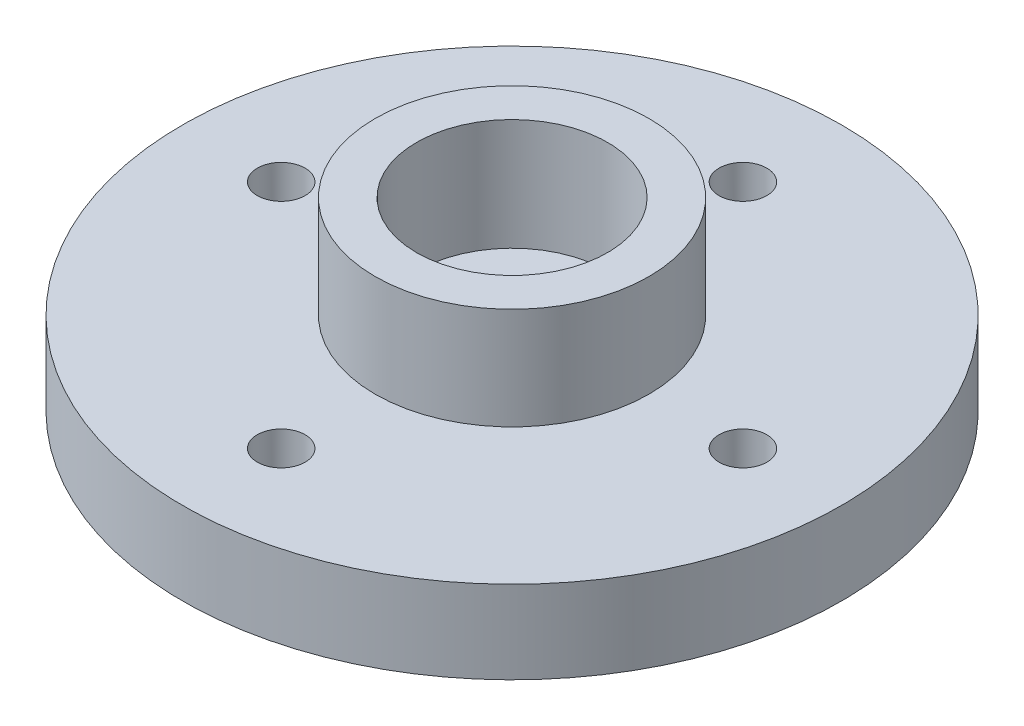
ISO-10303-21;
HEADER;
FILE_DESCRIPTION(('STEP AP214'),'2;1');
FILE_NAME('part.step','',(''),(''),'','','');
FILE_SCHEMA(('AUTOMOTIVE_DESIGN { 1 0 10303 214 1 1 1 1 }'));
ENDSEC;
DATA;
#1=APPLICATION_CONTEXT('core data for automotive mechanical design processes');
#2=APPLICATION_PROTOCOL_DEFINITION('international standard','automotive_design',2000,#1);
#3=PRODUCT_CONTEXT('',#1,'mechanical');
#4=PRODUCT('Part','Part','',(#3));
#5=PRODUCT_RELATED_PRODUCT_CATEGORY('part','',(#4));
#6=PRODUCT_DEFINITION_FORMATION('','',#4);
#7=PRODUCT_DEFINITION_CONTEXT('part definition',#1,'design');
#8=PRODUCT_DEFINITION('design','',#6,#7);
#9=PRODUCT_DEFINITION_SHAPE('','',#8);
#10=(LENGTH_UNIT() NAMED_UNIT(*) SI_UNIT(.MILLI.,.METRE.));
#11=(NAMED_UNIT(*) PLANE_ANGLE_UNIT() SI_UNIT($,.RADIAN.));
#12=(NAMED_UNIT(*) SI_UNIT($,.STERADIAN.) SOLID_ANGLE_UNIT());
#13=UNCERTAINTY_MEASURE_WITH_UNIT(LENGTH_MEASURE(1.E-05),#10,'distance_accuracy_value','');
#14=(GEOMETRIC_REPRESENTATION_CONTEXT(3) GLOBAL_UNCERTAINTY_ASSIGNED_CONTEXT((#13)) GLOBAL_UNIT_ASSIGNED_CONTEXT((#10,
#11,#12)) REPRESENTATION_CONTEXT('',''));
#15=CARTESIAN_POINT('',(0.,0.,0.));
#16=DIRECTION('',(0.,0.,1.));
#17=DIRECTION('',(1.,0.,0.));
#18=AXIS2_PLACEMENT_3D('',#15,#16,#17);
#19=CARTESIAN_POINT('',(0.,-0.6,0.));
#20=DIRECTION('',(0.,1.,0.));
#21=DIRECTION('',(0.,0.,1.));
#22=AXIS2_PLACEMENT_3D('',#19,#20,#21);
#23=PLANE('',#22);
#24=CARTESIAN_POINT('',(0.,-0.6,0.));
#25=DIRECTION('',(0.,-1.,0.));
#26=DIRECTION('',(0.,0.,-1.));
#27=AXIS2_PLACEMENT_3D('',#24,#25,#26);
#28=CIRCLE('',#27,3.55);
#29=CARTESIAN_POINT('',(0.,-0.6,-3.55));
#30=VERTEX_POINT('',#29);
#31=EDGE_CURVE('E10',#30,#30,#28,.T.);
#32=ORIENTED_EDGE('',*,*,#31,.T.);
#33=EDGE_LOOP('',(#32));
#34=FACE_BOUND('',#33,.T.);
#35=CARTESIAN_POINT('',(0.,-0.6,0.));
#36=DIRECTION('',(0.,1.,0.));
#37=DIRECTION('',(0.,0.,1.));
#38=AXIS2_PLACEMENT_3D('',#35,#36,#37);
#39=CIRCLE('',#38,1.5);
#40=CARTESIAN_POINT('',(0.,-0.600000000000002,1.5));
#41=VERTEX_POINT('',#40);
#42=EDGE_CURVE('E133',#41,#41,#39,.F.);
#43=ORIENTED_EDGE('',*,*,#42,.F.);
#44=EDGE_LOOP('',(#43));
#45=FACE_BOUND('',#44,.T.);
#46=ADVANCED_FACE('F39',(#34,#45),#23,.F.);
#47=CARTESIAN_POINT('',(0.,0.,0.));
#48=DIRECTION('',(0.,1.,0.));
#49=DIRECTION('',(0.,0.,1.));
#50=AXIS2_PLACEMENT_3D('',#47,#48,#49);
#51=CONICAL_SURFACE('',#50,4.83670415230573,1.13446401379631);
#52=ORIENTED_EDGE('',*,*,#31,.F.);
#53=EDGE_LOOP('',(#52));
#54=FACE_BOUND('',#53,.T.);
#55=CARTESIAN_POINT('',(0.,0.,0.));
#56=DIRECTION('',(0.,-1.,0.));
#57=DIRECTION('',(0.,0.,-1.));
#58=AXIS2_PLACEMENT_3D('',#55,#56,#57);
#59=CIRCLE('',#58,4.83670415230573);
#60=CARTESIAN_POINT('',(0.,0.,-4.83670415230573));
#61=VERTEX_POINT('',#60);
#62=EDGE_CURVE('E46',#61,#61,#59,.T.);
#63=ORIENTED_EDGE('',*,*,#62,.T.);
#64=EDGE_LOOP('',(#63));
#65=FACE_BOUND('',#64,.T.);
#66=ADVANCED_FACE('F127',(#54,#65),#51,.T.);
#67=CARTESIAN_POINT('',(-4.83670415230573,0.,0.));
#68=DIRECTION('',(0.,1.,0.));
#69=DIRECTION('',(0.,0.,1.));
#70=AXIS2_PLACEMENT_3D('',#67,#68,#69);
#71=PLANE('',#70);
#72=CARTESIAN_POINT('',(0.,0.,-7.25));
#73=DIRECTION('',(0.,1.,0.));
#74=DIRECTION('',(0.,0.,1.));
#75=AXIS2_PLACEMENT_3D('',#72,#73,#74);
#76=CIRCLE('',#75,0.75);
#77=CARTESIAN_POINT('',(0.,0.,-6.5));
#78=VERTEX_POINT('',#77);
#79=EDGE_CURVE('E80',#78,#78,#76,.T.);
#80=ORIENTED_EDGE('',*,*,#79,.T.);
#81=EDGE_LOOP('',(#80));
#82=FACE_BOUND('',#81,.T.);
#83=CARTESIAN_POINT('',(7.25,0.,0.));
#84=DIRECTION('',(0.,1.,0.));
#85=DIRECTION('',(0.,0.,1.));
#86=AXIS2_PLACEMENT_3D('',#83,#84,#85);
#87=CIRCLE('',#86,0.75);
#88=CARTESIAN_POINT('',(7.25,0.,0.750000000000025));
#89=VERTEX_POINT('',#88);
#90=EDGE_CURVE('E63',#89,#89,#87,.T.);
#91=ORIENTED_EDGE('',*,*,#90,.T.);
#92=EDGE_LOOP('',(#91));
#93=FACE_BOUND('',#92,.T.);
#94=CARTESIAN_POINT('',(0.,0.,7.25));
#95=DIRECTION('',(0.,1.,0.));
#96=DIRECTION('',(0.,0.,1.));
#97=AXIS2_PLACEMENT_3D('',#94,#95,#96);
#98=CIRCLE('',#97,0.75);
#99=CARTESIAN_POINT('',(0.,0.,8.));
#100=VERTEX_POINT('',#99);
#101=EDGE_CURVE('E65',#100,#100,#98,.T.);
#102=ORIENTED_EDGE('',*,*,#101,.T.);
#103=EDGE_LOOP('',(#102));
#104=FACE_BOUND('',#103,.T.);
#105=CARTESIAN_POINT('',(-7.25,0.,0.));
#106=DIRECTION('',(0.,1.,0.));
#107=DIRECTION('',(0.,0.,1.));
#108=AXIS2_PLACEMENT_3D('',#105,#106,#107);
#109=CIRCLE('',#108,0.75);
#110=CARTESIAN_POINT('',(-7.25,0.,0.749999999999924));
#111=VERTEX_POINT('',#110);
#112=EDGE_CURVE('E59',#111,#111,#109,.T.);
#113=ORIENTED_EDGE('',*,*,#112,.T.);
#114=EDGE_LOOP('',(#113));
#115=FACE_BOUND('',#114,.T.);
#116=ORIENTED_EDGE('',*,*,#62,.F.);
#117=EDGE_LOOP('',(#116));
#118=FACE_BOUND('',#117,.T.);
#119=CARTESIAN_POINT('',(0.,0.,0.));
#120=DIRECTION('',(0.,-1.,0.));
#121=DIRECTION('',(0.,0.,-1.));
#122=AXIS2_PLACEMENT_3D('',#119,#120,#121);
#123=CIRCLE('',#122,10.35);
#124=CARTESIAN_POINT('',(0.,0.,-10.35));
#125=VERTEX_POINT('',#124);
#126=EDGE_CURVE('E51',#125,#125,#123,.T.);
#127=ORIENTED_EDGE('',*,*,#126,.T.);
#128=EDGE_LOOP('',(#127));
#129=FACE_BOUND('',#128,.T.);
#130=ADVANCED_FACE('F93',(#82,#93,#104,#115,#118,#129),#71,.F.);
#131=CARTESIAN_POINT('',(0.,0.,0.));
#132=DIRECTION('',(0.,-1.,0.));
#133=DIRECTION('',(0.,0.,-1.));
#134=AXIS2_PLACEMENT_3D('',#131,#132,#133);
#135=CYLINDRICAL_SURFACE('',#134,10.35);
#136=ORIENTED_EDGE('',*,*,#126,.F.);
#137=EDGE_LOOP('',(#136));
#138=FACE_BOUND('',#137,.T.);
#139=CARTESIAN_POINT('',(0.,2.6,0.));
#140=DIRECTION('',(0.,-1.,0.));
#141=DIRECTION('',(0.,0.,-1.));
#142=AXIS2_PLACEMENT_3D('',#139,#140,#141);
#143=CIRCLE('',#142,10.35);
#144=CARTESIAN_POINT('',(0.,2.6,-10.35));
#145=VERTEX_POINT('',#144);
#146=EDGE_CURVE('E87',#145,#145,#143,.T.);
#147=ORIENTED_EDGE('',*,*,#146,.T.);
#148=EDGE_LOOP('',(#147));
#149=FACE_BOUND('',#148,.T.);
#150=ADVANCED_FACE('F91',(#138,#149),#135,.T.);
#151=CARTESIAN_POINT('',(-10.35,2.6,0.));
#152=DIRECTION('',(0.,-1.,0.));
#153=DIRECTION('',(0.,0.,-1.));
#154=AXIS2_PLACEMENT_3D('',#151,#152,#153);
#155=PLANE('',#154);
#156=CARTESIAN_POINT('',(0.,2.6,-7.25));
#157=DIRECTION('',(0.,-1.,0.));
#158=DIRECTION('',(0.,0.,-1.));
#159=AXIS2_PLACEMENT_3D('',#156,#157,#158);
#160=CIRCLE('',#159,0.75);
#161=CARTESIAN_POINT('',(0.,2.6,-8.));
#162=VERTEX_POINT('',#161);
#163=EDGE_CURVE('E45',#162,#162,#160,.T.);
#164=ORIENTED_EDGE('',*,*,#163,.T.);
#165=EDGE_LOOP('',(#164));
#166=FACE_BOUND('',#165,.T.);
#167=CARTESIAN_POINT('',(7.25,2.6,0.));
#168=DIRECTION('',(0.,-1.,0.));
#169=DIRECTION('',(0.,0.,-1.));
#170=AXIS2_PLACEMENT_3D('',#167,#168,#169);
#171=CIRCLE('',#170,0.75);
#172=CARTESIAN_POINT('',(7.25,2.6,-0.749999999999975));
#173=VERTEX_POINT('',#172);
#174=EDGE_CURVE('E64',#173,#173,#171,.T.);
#175=ORIENTED_EDGE('',*,*,#174,.T.);
#176=EDGE_LOOP('',(#175));
#177=FACE_BOUND('',#176,.T.);
#178=CARTESIAN_POINT('',(0.,2.6,7.25));
#179=DIRECTION('',(0.,-1.,0.));
#180=DIRECTION('',(0.,0.,-1.));
#181=AXIS2_PLACEMENT_3D('',#178,#179,#180);
#182=CIRCLE('',#181,0.75);
#183=CARTESIAN_POINT('',(0.,2.6,6.5));
#184=VERTEX_POINT('',#183);
#185=EDGE_CURVE('E58',#184,#184,#182,.T.);
#186=ORIENTED_EDGE('',*,*,#185,.T.);
#187=EDGE_LOOP('',(#186));
#188=FACE_BOUND('',#187,.T.);
#189=CARTESIAN_POINT('',(-7.25,2.6,0.));
#190=DIRECTION('',(0.,-1.,0.));
#191=DIRECTION('',(0.,0.,-1.));
#192=AXIS2_PLACEMENT_3D('',#189,#190,#191);
#193=CIRCLE('',#192,0.75);
#194=CARTESIAN_POINT('',(-7.25,2.6,-0.750000000000076));
#195=VERTEX_POINT('',#194);
#196=EDGE_CURVE('E54',#195,#195,#193,.T.);
#197=ORIENTED_EDGE('',*,*,#196,.T.);
#198=EDGE_LOOP('',(#197));
#199=FACE_BOUND('',#198,.T.);
#200=ORIENTED_EDGE('',*,*,#146,.F.);
#201=EDGE_LOOP('',(#200));
#202=FACE_BOUND('',#201,.T.);
#203=CARTESIAN_POINT('',(0.,2.6,0.));
#204=DIRECTION('',(0.,-1.,0.));
#205=DIRECTION('',(0.,0.,-1.));
#206=AXIS2_PLACEMENT_3D('',#203,#204,#205);
#207=CIRCLE('',#206,4.3);
#208=CARTESIAN_POINT('',(0.,2.6,-4.3));
#209=VERTEX_POINT('',#208);
#210=EDGE_CURVE('E84',#209,#209,#207,.T.);
#211=ORIENTED_EDGE('',*,*,#210,.T.);
#212=EDGE_LOOP('',(#211));
#213=FACE_BOUND('',#212,.T.);
#214=ADVANCED_FACE('F98',(#166,#177,#188,#199,#202,#213),#155,.F.);
#215=CARTESIAN_POINT('',(0.,0.,0.));
#216=DIRECTION('',(0.,-1.,0.));
#217=DIRECTION('',(0.,0.,-1.));
#218=AXIS2_PLACEMENT_3D('',#215,#216,#217);
#219=CYLINDRICAL_SURFACE('',#218,4.3);
#220=ORIENTED_EDGE('',*,*,#210,.F.);
#221=EDGE_LOOP('',(#220));
#222=FACE_BOUND('',#221,.T.);
#223=CARTESIAN_POINT('',(0.,5.8,0.));
#224=DIRECTION('',(0.,-1.,0.));
#225=DIRECTION('',(0.,0.,-1.));
#226=AXIS2_PLACEMENT_3D('',#223,#224,#225);
#227=CIRCLE('',#226,4.3);
#228=CARTESIAN_POINT('',(0.,5.8,-4.3));
#229=VERTEX_POINT('',#228);
#230=EDGE_CURVE('E78',#229,#229,#227,.T.);
#231=ORIENTED_EDGE('',*,*,#230,.T.);
#232=EDGE_LOOP('',(#231));
#233=FACE_BOUND('',#232,.T.);
#234=ADVANCED_FACE('F105',(#222,#233),#219,.T.);
#235=CARTESIAN_POINT('',(-4.3,5.8,0.));
#236=DIRECTION('',(0.,-1.,0.));
#237=DIRECTION('',(0.,0.,-1.));
#238=AXIS2_PLACEMENT_3D('',#235,#236,#237);
#239=PLANE('',#238);
#240=CARTESIAN_POINT('',(0.,5.8,0.));
#241=DIRECTION('',(0.,1.,0.));
#242=DIRECTION('',(0.,0.,1.));
#243=AXIS2_PLACEMENT_3D('',#240,#241,#242);
#244=CIRCLE('',#243,3.);
#245=CARTESIAN_POINT('',(0.,5.8,3.));
#246=VERTEX_POINT('',#245);
#247=EDGE_CURVE('E56',#246,#246,#244,.T.);
#248=ORIENTED_EDGE('',*,*,#247,.F.);
#249=EDGE_LOOP('',(#248));
#250=FACE_BOUND('',#249,.T.);
#251=ORIENTED_EDGE('',*,*,#230,.F.);
#252=EDGE_LOOP('',(#251));
#253=FACE_BOUND('',#252,.T.);
#254=ADVANCED_FACE('F107',(#250,#253),#239,.F.);
#255=CARTESIAN_POINT('',(0.,-4.2,0.));
#256=DIRECTION('',(0.,1.,0.));
#257=DIRECTION('',(0.,0.,1.));
#258=AXIS2_PLACEMENT_3D('',#255,#256,#257);
#259=CYLINDRICAL_SURFACE('',#258,3.);
#260=CARTESIAN_POINT('',(0.,2.3,0.));
#261=DIRECTION('',(0.,1.,0.));
#262=DIRECTION('',(0.,0.,1.));
#263=AXIS2_PLACEMENT_3D('',#260,#261,#262);
#264=CIRCLE('',#263,3.);
#265=CARTESIAN_POINT('',(0.,2.3,3.));
#266=VERTEX_POINT('',#265);
#267=EDGE_CURVE('E140',#266,#266,#264,.T.);
#268=ORIENTED_EDGE('',*,*,#267,.F.);
#269=EDGE_LOOP('',(#268));
#270=FACE_BOUND('',#269,.T.);
#271=ORIENTED_EDGE('',*,*,#247,.T.);
#272=EDGE_LOOP('',(#271));
#273=FACE_BOUND('',#272,.T.);
#274=ADVANCED_FACE('F112',(#270,#273),#259,.F.);
#275=CARTESIAN_POINT('',(-7.25,-4.2,0.));
#276=DIRECTION('',(0.,1.,0.));
#277=DIRECTION('',(0.,0.,1.));
#278=AXIS2_PLACEMENT_3D('',#275,#276,#277);
#279=CYLINDRICAL_SURFACE('',#278,0.75);
#280=ORIENTED_EDGE('',*,*,#196,.F.);
#281=EDGE_LOOP('',(#280));
#282=FACE_BOUND('',#281,.T.);
#283=ORIENTED_EDGE('',*,*,#112,.F.);
#284=EDGE_LOOP('',(#283));
#285=FACE_BOUND('',#284,.T.);
#286=ADVANCED_FACE('F122',(#282,#285),#279,.F.);
#287=CARTESIAN_POINT('',(0.,-4.2,7.25));
#288=DIRECTION('',(0.,1.,0.));
#289=DIRECTION('',(0.,0.,1.));
#290=AXIS2_PLACEMENT_3D('',#287,#288,#289);
#291=CYLINDRICAL_SURFACE('',#290,0.75);
#292=ORIENTED_EDGE('',*,*,#185,.F.);
#293=EDGE_LOOP('',(#292));
#294=FACE_BOUND('',#293,.T.);
#295=ORIENTED_EDGE('',*,*,#101,.F.);
#296=EDGE_LOOP('',(#295));
#297=FACE_BOUND('',#296,.T.);
#298=ADVANCED_FACE('F165',(#294,#297),#291,.F.);
#299=CARTESIAN_POINT('',(7.25,-4.2,0.));
#300=DIRECTION('',(0.,1.,0.));
#301=DIRECTION('',(0.,0.,1.));
#302=AXIS2_PLACEMENT_3D('',#299,#300,#301);
#303=CYLINDRICAL_SURFACE('',#302,0.75);
#304=ORIENTED_EDGE('',*,*,#174,.F.);
#305=EDGE_LOOP('',(#304));
#306=FACE_BOUND('',#305,.T.);
#307=ORIENTED_EDGE('',*,*,#90,.F.);
#308=EDGE_LOOP('',(#307));
#309=FACE_BOUND('',#308,.T.);
#310=ADVANCED_FACE('F157',(#306,#309),#303,.F.);
#311=CARTESIAN_POINT('',(0.,-4.2,-7.25));
#312=DIRECTION('',(0.,1.,0.));
#313=DIRECTION('',(0.,0.,1.));
#314=AXIS2_PLACEMENT_3D('',#311,#312,#313);
#315=CYLINDRICAL_SURFACE('',#314,0.75);
#316=ORIENTED_EDGE('',*,*,#163,.F.);
#317=EDGE_LOOP('',(#316));
#318=FACE_BOUND('',#317,.T.);
#319=ORIENTED_EDGE('',*,*,#79,.F.);
#320=EDGE_LOOP('',(#319));
#321=FACE_BOUND('',#320,.T.);
#322=ADVANCED_FACE('F154',(#318,#321),#315,.F.);
#323=CARTESIAN_POINT('',(0.,2.3,0.));
#324=DIRECTION('',(0.,1.,0.));
#325=DIRECTION('',(0.,0.,1.));
#326=AXIS2_PLACEMENT_3D('',#323,#324,#325);
#327=PLANE('',#326);
#328=CARTESIAN_POINT('',(0.,2.3,0.));
#329=DIRECTION('',(0.,1.,0.));
#330=DIRECTION('',(0.,0.,1.));
#331=AXIS2_PLACEMENT_3D('',#328,#329,#330);
#332=CIRCLE('',#331,1.5);
#333=CARTESIAN_POINT('',(0.,2.3,1.5));
#334=VERTEX_POINT('',#333);
#335=EDGE_CURVE('E142',#334,#334,#332,.T.);
#336=ORIENTED_EDGE('',*,*,#335,.F.);
#337=EDGE_LOOP('',(#336));
#338=FACE_BOUND('',#337,.T.);
#339=ORIENTED_EDGE('',*,*,#267,.T.);
#340=EDGE_LOOP('',(#339));
#341=FACE_BOUND('',#340,.T.);
#342=ADVANCED_FACE('F146',(#338,#341),#327,.T.);
#343=CARTESIAN_POINT('',(0.,-9.08528137423857,0.));
#344=DIRECTION('',(0.,1.,0.));
#345=DIRECTION('',(0.,0.,1.));
#346=AXIS2_PLACEMENT_3D('',#343,#344,#345);
#347=CYLINDRICAL_SURFACE('',#346,1.5);
#348=CARTESIAN_POINT('',(0.,-0.600000000000002,1.5));
#349=CARTESIAN_POINT('',(0.,-0.569791666666668,1.5));
#350=CARTESIAN_POINT('',(0.,-0.539583333333335,1.5));
#351=CARTESIAN_POINT('',(0.,-0.479166666666668,1.5));
#352=CARTESIAN_POINT('',(0.,-0.448958333333334,1.5));
#353=CARTESIAN_POINT('',(0.,-0.388541666666668,1.5));
#354=CARTESIAN_POINT('',(0.,-0.358333333333335,1.5));
#355=CARTESIAN_POINT('',(0.,-0.297916666666669,1.5));
#356=CARTESIAN_POINT('',(0.,-0.267708333333335,1.5));
#357=CARTESIAN_POINT('',(0.,-0.207291666666668,1.5));
#358=CARTESIAN_POINT('',(0.,-0.177083333333335,1.5));
#359=CARTESIAN_POINT('',(0.,-0.116666666666668,1.5));
#360=CARTESIAN_POINT('',(0.,-0.0864583333333354,1.5));
#361=CARTESIAN_POINT('',(0.,-0.026041666666669,1.5));
#362=CARTESIAN_POINT('',(0.,0.00416666666666447,1.5));
#363=CARTESIAN_POINT('',(0.,0.0645833333333314,1.5));
#364=CARTESIAN_POINT('',(0.,0.0947916666666649,1.5));
#365=CARTESIAN_POINT('',(0.,0.155208333333332,1.5));
#366=CARTESIAN_POINT('',(0.,0.185416666666665,1.5));
#367=CARTESIAN_POINT('',(0.,0.245833333333332,1.5));
#368=CARTESIAN_POINT('',(0.,0.276041666666666,1.5));
#369=CARTESIAN_POINT('',(0.,0.336458333333332,1.5));
#370=CARTESIAN_POINT('',(0.,0.366666666666665,1.5));
#371=CARTESIAN_POINT('',(0.,0.427083333333331,1.5));
#372=CARTESIAN_POINT('',(0.,0.457291666666665,1.5));
#373=CARTESIAN_POINT('',(0.,0.517708333333332,1.5));
#374=CARTESIAN_POINT('',(0.,0.547916666666665,1.5));
#375=CARTESIAN_POINT('',(0.,0.608333333333332,1.5));
#376=CARTESIAN_POINT('',(0.,0.638541666666665,1.5));
#377=CARTESIAN_POINT('',(0.,0.698958333333331,1.5));
#378=CARTESIAN_POINT('',(0.,0.729166666666664,1.5));
#379=CARTESIAN_POINT('',(0.,0.789583333333331,1.5));
#380=CARTESIAN_POINT('',(0.,0.819791666666665,1.5));
#381=CARTESIAN_POINT('',(0.,0.880208333333332,1.5));
#382=CARTESIAN_POINT('',(0.,0.910416666666665,1.5));
#383=CARTESIAN_POINT('',(0.,0.970833333333332,1.5));
#384=CARTESIAN_POINT('',(0.,1.00104166666667,1.5));
#385=CARTESIAN_POINT('',(0.,1.06145833333333,1.5));
#386=CARTESIAN_POINT('',(0.,1.09166666666667,1.5));
#387=CARTESIAN_POINT('',(0.,1.15208333333333,1.5));
#388=CARTESIAN_POINT('',(0.,1.18229166666666,1.5));
#389=CARTESIAN_POINT('',(0.,1.24270833333333,1.5));
#390=CARTESIAN_POINT('',(0.,1.27291666666667,1.5));
#391=CARTESIAN_POINT('',(0.,1.33333333333333,1.5));
#392=CARTESIAN_POINT('',(0.,1.36354166666666,1.5));
#393=CARTESIAN_POINT('',(0.,1.42395833333333,1.5));
#394=CARTESIAN_POINT('',(0.,1.45416666666666,1.5));
#395=CARTESIAN_POINT('',(0.,1.51458333333333,1.5));
#396=CARTESIAN_POINT('',(0.,1.54479166666666,1.5));
#397=CARTESIAN_POINT('',(0.,1.60520833333333,1.5));
#398=CARTESIAN_POINT('',(0.,1.63541666666667,1.5));
#399=CARTESIAN_POINT('',(0.,1.69583333333333,1.5));
#400=CARTESIAN_POINT('',(0.,1.72604166666667,1.5));
#401=CARTESIAN_POINT('',(0.,1.78645833333333,1.5));
#402=CARTESIAN_POINT('',(0.,1.81666666666667,1.5));
#403=CARTESIAN_POINT('',(0.,1.87708333333333,1.5));
#404=CARTESIAN_POINT('',(0.,1.90729166666666,1.5));
#405=CARTESIAN_POINT('',(0.,1.96770833333333,1.5));
#406=CARTESIAN_POINT('',(0.,1.99791666666667,1.5));
#407=CARTESIAN_POINT('',(0.,2.05833333333333,1.5));
#408=CARTESIAN_POINT('',(0.,2.08854166666666,1.5));
#409=CARTESIAN_POINT('',(0.,2.14895833333333,1.5));
#410=CARTESIAN_POINT('',(0.,2.17916666666666,1.5));
#411=CARTESIAN_POINT('',(0.,2.23958333333333,1.5));
#412=CARTESIAN_POINT('',(0.,2.26979166666666,1.5));
#413=CARTESIAN_POINT('',(0.,2.3,1.5));
#414=B_SPLINE_CURVE_WITH_KNOTS('',3,(#348,#349,#350,#351,#352,#353,#354,#355,#356,#357,#358,
#359,#360,#361,#362,#363,#364,#365,#366,#367,#368,#369,#370,#371,#372,#373,#374,#375,#376,#377,
#378,#379,#380,#381,#382,#383,#384,#385,#386,#387,#388,#389,#390,#391,#392,#393,#394,#395,#396,
#397,#398,#399,#400,#401,#402,#403,#404,#405,#406,#407,#408,#409,#410,#411,#412,#413),
.UNSPECIFIED.,.F.,.F.,(4,2,2,2,2,2,2,2,2,2,2,2,2,2,2,2,2,2,2,2,2,2,2,2,2,2,2,2,2,2,2,2,4),(0.,
0.0906250000000004,0.181250000000001,0.271875,0.3625,0.453125,0.543749999999999,
0.634374999999999,0.725,0.815625,0.906250000000001,0.996875,1.0875,1.178125,1.26875,1.359375,
1.45,1.540625,1.63125,1.721875,1.8125,1.903125,1.99375,2.084375,2.175,2.265625,2.35625,2.446875,
2.5375,2.628125,2.71875,2.809375,2.9),.UNSPECIFIED.);
#415=EDGE_CURVE('BSEAM150',#41,#334,#414,.T.);
#416=ORIENTED_EDGE('',*,*,#42,.T.);
#417=ORIENTED_EDGE('',*,*,#335,.T.);
#418=ORIENTED_EDGE('',*,*,#415,.T.);
#419=ORIENTED_EDGE('',*,*,#415,.F.);
#420=EDGE_LOOP('',(#416,#418,#417,#419));
#421=FACE_BOUND('',#420,.T.);
#422=ADVANCED_FACE('F150',(#421),#347,.F.);
#423=CLOSED_SHELL('',(#46,#66,#130,#150,#214,#234,#254,#274,#286,#298,#310,#322,#342,#422));
#424=MANIFOLD_SOLID_BREP('B2',#423);
#425=ADVANCED_BREP_SHAPE_REPRESENTATION('',(#18,#424),#14);
#426=SHAPE_DEFINITION_REPRESENTATION(#9,#425);
ENDSEC;
END-ISO-10303-21;
